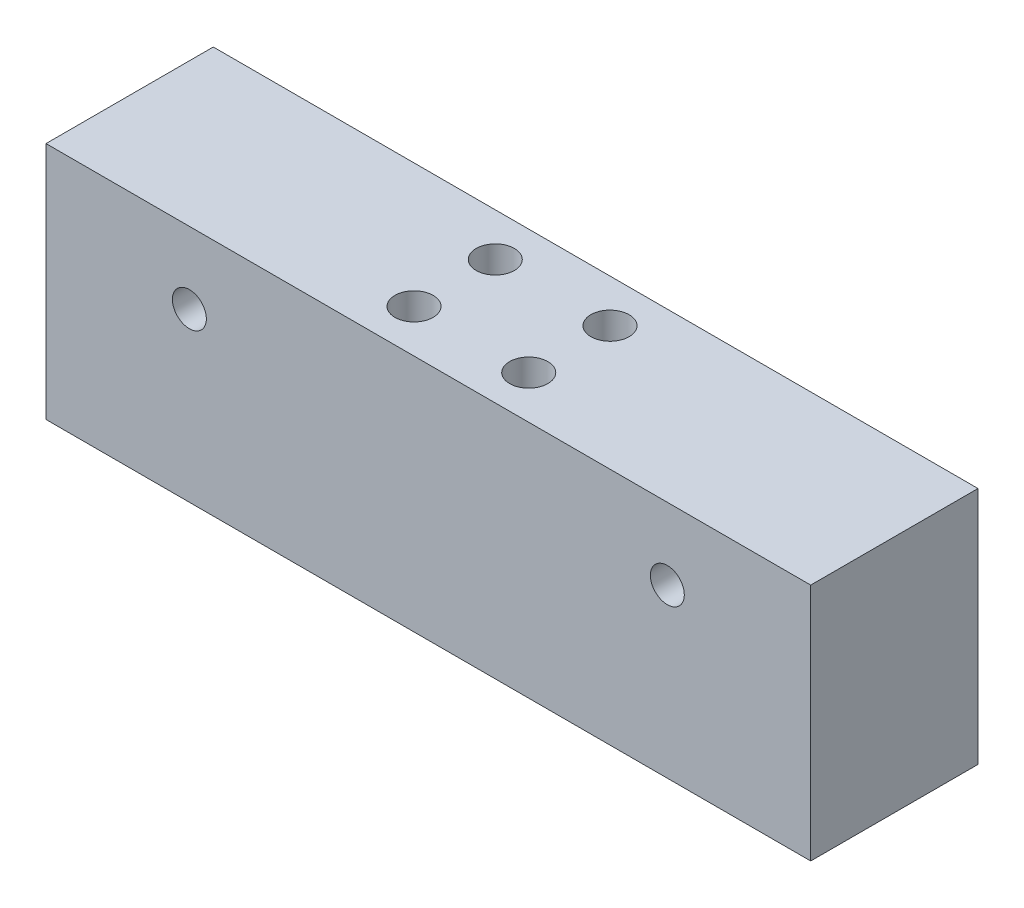
ISO-10303-21;
HEADER;
FILE_DESCRIPTION(('STEP AP214'),'2;1');
FILE_NAME('part.step','',(''),(''),'','','');
FILE_SCHEMA(('AUTOMOTIVE_DESIGN { 1 0 10303 214 1 1 1 1 }'));
ENDSEC;
DATA;
#1=APPLICATION_CONTEXT('core data for automotive mechanical design processes');
#2=APPLICATION_PROTOCOL_DEFINITION('international standard','automotive_design',2000,#1);
#3=PRODUCT_CONTEXT('',#1,'mechanical');
#4=PRODUCT('Part','Part','',(#3));
#5=PRODUCT_RELATED_PRODUCT_CATEGORY('part','',(#4));
#6=PRODUCT_DEFINITION_FORMATION('','',#4);
#7=PRODUCT_DEFINITION_CONTEXT('part definition',#1,'design');
#8=PRODUCT_DEFINITION('design','',#6,#7);
#9=PRODUCT_DEFINITION_SHAPE('','',#8);
#10=(LENGTH_UNIT() NAMED_UNIT(*) SI_UNIT(.MILLI.,.METRE.));
#11=(NAMED_UNIT(*) PLANE_ANGLE_UNIT() SI_UNIT($,.RADIAN.));
#12=(NAMED_UNIT(*) SI_UNIT($,.STERADIAN.) SOLID_ANGLE_UNIT());
#13=UNCERTAINTY_MEASURE_WITH_UNIT(LENGTH_MEASURE(1.E-05),#10,'distance_accuracy_value','');
#14=(GEOMETRIC_REPRESENTATION_CONTEXT(3) GLOBAL_UNCERTAINTY_ASSIGNED_CONTEXT((#13)) GLOBAL_UNIT_ASSIGNED_CONTEXT((#10,
#11,#12)) REPRESENTATION_CONTEXT('',''));
#15=CARTESIAN_POINT('',(0.,0.,0.));
#16=DIRECTION('',(0.,0.,1.));
#17=DIRECTION('',(1.,0.,0.));
#18=AXIS2_PLACEMENT_3D('',#15,#16,#17);
#19=CARTESIAN_POINT('',(1.48000000000004,64.235,9.));
#20=DIRECTION('',(0.,-1.,0.));
#21=DIRECTION('',(1.,0.,0.));
#22=AXIS2_PLACEMENT_3D('',#19,#20,#21);
#23=CYLINDRICAL_SURFACE('',#22,2.25);
#24=CARTESIAN_POINT('',(1.48000000000005,14.235,9.));
#25=DIRECTION('',(0.,-1.,0.));
#26=DIRECTION('',(1.,0.,0.));
#27=AXIS2_PLACEMENT_3D('',#24,#25,#26);
#28=CIRCLE('',#27,2.25);
#29=CARTESIAN_POINT('',(3.73000000000005,14.235,9.));
#30=VERTEX_POINT('',#29);
#31=EDGE_CURVE('E136',#30,#30,#28,.T.);
#32=CARTESIAN_POINT('',(1.48000000000004,54.235,9.));
#33=DIRECTION('',(0.,1.,0.));
#34=DIRECTION('',(0.,0.,1.));
#35=AXIS2_PLACEMENT_3D('',#32,#33,#34);
#36=CIRCLE('',#35,2.25);
#37=CARTESIAN_POINT('',(3.73000000000004,54.235,9.));
#38=VERTEX_POINT('',#37);
#39=EDGE_CURVE('E36',#38,#38,#36,.F.);
#40=CARTESIAN_POINT('',(3.73000000000005,14.235,9.));
#41=CARTESIAN_POINT('',(3.73000000000004,14.6516666666667,9.));
#42=CARTESIAN_POINT('',(3.73000000000004,15.0683333333333,9.));
#43=CARTESIAN_POINT('',(3.73000000000004,15.9016666666667,9.));
#44=CARTESIAN_POINT('',(3.73000000000004,16.3183333333333,9.));
#45=CARTESIAN_POINT('',(3.73000000000004,17.1516666666667,9.));
#46=CARTESIAN_POINT('',(3.73000000000004,17.5683333333333,9.));
#47=CARTESIAN_POINT('',(3.73000000000004,18.4016666666667,9.));
#48=CARTESIAN_POINT('',(3.73000000000004,18.8183333333333,9.));
#49=CARTESIAN_POINT('',(3.73000000000004,19.6516666666667,9.));
#50=CARTESIAN_POINT('',(3.73000000000004,20.0683333333333,9.));
#51=CARTESIAN_POINT('',(3.73000000000004,20.9016666666667,9.));
#52=CARTESIAN_POINT('',(3.73000000000004,21.3183333333333,9.));
#53=CARTESIAN_POINT('',(3.73000000000004,22.1516666666667,9.));
#54=CARTESIAN_POINT('',(3.73000000000004,22.5683333333333,9.));
#55=CARTESIAN_POINT('',(3.73000000000004,23.4016666666667,9.));
#56=CARTESIAN_POINT('',(3.73000000000004,23.8183333333333,9.));
#57=CARTESIAN_POINT('',(3.73000000000004,24.6516666666667,9.));
#58=CARTESIAN_POINT('',(3.73000000000004,25.0683333333333,9.));
#59=CARTESIAN_POINT('',(3.73000000000004,25.9016666666667,9.));
#60=CARTESIAN_POINT('',(3.73000000000004,26.3183333333333,9.));
#61=CARTESIAN_POINT('',(3.73000000000004,27.1516666666667,9.));
#62=CARTESIAN_POINT('',(3.73000000000004,27.5683333333333,9.));
#63=CARTESIAN_POINT('',(3.73000000000004,28.4016666666667,9.));
#64=CARTESIAN_POINT('',(3.73000000000004,28.8183333333333,9.));
#65=CARTESIAN_POINT('',(3.73000000000004,29.6516666666667,9.));
#66=CARTESIAN_POINT('',(3.73000000000004,30.0683333333333,9.));
#67=CARTESIAN_POINT('',(3.73000000000004,30.9016666666667,9.));
#68=CARTESIAN_POINT('',(3.73000000000004,31.3183333333333,9.));
#69=CARTESIAN_POINT('',(3.73000000000004,32.1516666666667,9.));
#70=CARTESIAN_POINT('',(3.73000000000004,32.5683333333333,9.));
#71=CARTESIAN_POINT('',(3.73000000000004,33.4016666666667,9.));
#72=CARTESIAN_POINT('',(3.73000000000004,33.8183333333333,9.));
#73=CARTESIAN_POINT('',(3.73000000000004,34.6516666666667,9.));
#74=CARTESIAN_POINT('',(3.73000000000004,35.0683333333333,9.));
#75=CARTESIAN_POINT('',(3.73000000000004,35.9016666666667,9.));
#76=CARTESIAN_POINT('',(3.73000000000004,36.3183333333333,9.));
#77=CARTESIAN_POINT('',(3.73000000000004,37.1516666666667,9.));
#78=CARTESIAN_POINT('',(3.73000000000004,37.5683333333333,9.));
#79=CARTESIAN_POINT('',(3.73000000000004,38.4016666666667,9.));
#80=CARTESIAN_POINT('',(3.73000000000004,38.8183333333333,9.));
#81=CARTESIAN_POINT('',(3.73000000000004,39.6516666666667,9.));
#82=CARTESIAN_POINT('',(3.73000000000004,40.0683333333333,9.));
#83=CARTESIAN_POINT('',(3.73000000000004,40.9016666666667,9.));
#84=CARTESIAN_POINT('',(3.73000000000004,41.3183333333333,9.));
#85=CARTESIAN_POINT('',(3.73000000000004,42.1516666666667,9.));
#86=CARTESIAN_POINT('',(3.73000000000004,42.5683333333333,9.));
#87=CARTESIAN_POINT('',(3.73000000000004,43.4016666666667,9.));
#88=CARTESIAN_POINT('',(3.73000000000004,43.8183333333333,9.));
#89=CARTESIAN_POINT('',(3.73000000000004,44.6516666666667,9.));
#90=CARTESIAN_POINT('',(3.73000000000004,45.0683333333333,9.));
#91=CARTESIAN_POINT('',(3.73000000000004,45.9016666666667,9.));
#92=CARTESIAN_POINT('',(3.73000000000004,46.3183333333333,9.));
#93=CARTESIAN_POINT('',(3.73000000000004,47.1516666666667,9.));
#94=CARTESIAN_POINT('',(3.73000000000004,47.5683333333333,9.));
#95=CARTESIAN_POINT('',(3.73000000000004,48.4016666666667,9.));
#96=CARTESIAN_POINT('',(3.73000000000004,48.8183333333333,9.));
#97=CARTESIAN_POINT('',(3.73000000000004,49.6516666666667,9.));
#98=CARTESIAN_POINT('',(3.73000000000004,50.0683333333333,9.));
#99=CARTESIAN_POINT('',(3.73000000000004,50.9016666666667,9.));
#100=CARTESIAN_POINT('',(3.73000000000004,51.3183333333333,9.));
#101=CARTESIAN_POINT('',(3.73000000000004,52.1516666666667,9.));
#102=CARTESIAN_POINT('',(3.73000000000004,52.5683333333333,9.));
#103=CARTESIAN_POINT('',(3.73000000000004,53.4016666666667,9.));
#104=CARTESIAN_POINT('',(3.73000000000004,53.8183333333333,9.));
#105=CARTESIAN_POINT('',(3.73000000000004,54.235,9.));
#106=B_SPLINE_CURVE_WITH_KNOTS('',3,(#40,#41,#42,#43,#44,#45,#46,#47,#48,#49,#50,#51,#52,#53,
#54,#55,#56,#57,#58,#59,#60,#61,#62,#63,#64,#65,#66,#67,#68,#69,#70,#71,#72,#73,#74,#75,#76,#77,
#78,#79,#80,#81,#82,#83,#84,#85,#86,#87,#88,#89,#90,#91,#92,#93,#94,#95,#96,#97,#98,#99,#100,
#101,#102,#103,#104,#105),.UNSPECIFIED.,.F.,.F.,(4,2,2,2,2,2,2,2,2,2,2,2,2,2,2,2,2,2,2,2,2,2,2,
2,2,2,2,2,2,2,2,2,4),(0.,1.25,2.5,3.75,5.,6.25,7.5,8.75,9.99999999999999,11.25,12.5,13.75,15.,
16.25,17.5,18.75,20.,21.25,22.5,23.75,25.,26.25,27.5,28.75,30.,31.25,32.5,33.75,35.,36.25,37.5,
38.75,40.),.UNSPECIFIED.);
#107=EDGE_CURVE('BSEAM32',#30,#38,#106,.T.);
#108=ORIENTED_EDGE('',*,*,#31,.T.);
#109=ORIENTED_EDGE('',*,*,#39,.F.);
#110=ORIENTED_EDGE('',*,*,#107,.T.);
#111=ORIENTED_EDGE('',*,*,#107,.F.);
#112=EDGE_LOOP('',(#108,#110,#109,#111));
#113=FACE_BOUND('',#112,.T.);
#114=ADVANCED_FACE('F32',(#113),#23,.F.);
#115=CARTESIAN_POINT('',(-22.52,64.235,26.));
#116=DIRECTION('',(0.,-1.,0.));
#117=DIRECTION('',(1.,0.,0.));
#118=AXIS2_PLACEMENT_3D('',#115,#116,#117);
#119=CYLINDRICAL_SURFACE('',#118,2.25);
#120=CARTESIAN_POINT('',(-22.52,14.235,26.));
#121=DIRECTION('',(0.,-1.,0.));
#122=DIRECTION('',(1.,0.,0.));
#123=AXIS2_PLACEMENT_3D('',#120,#121,#122);
#124=CIRCLE('',#123,2.25);
#125=CARTESIAN_POINT('',(-20.27,14.235,26.));
#126=VERTEX_POINT('',#125);
#127=EDGE_CURVE('E120',#126,#126,#124,.T.);
#128=CARTESIAN_POINT('',(-22.52,54.235,26.));
#129=DIRECTION('',(0.,1.,0.));
#130=DIRECTION('',(0.,0.,1.));
#131=AXIS2_PLACEMENT_3D('',#128,#129,#130);
#132=CIRCLE('',#131,2.25);
#133=CARTESIAN_POINT('',(-20.27,54.235,26.));
#134=VERTEX_POINT('',#133);
#135=EDGE_CURVE('E115',#134,#134,#132,.F.);
#136=CARTESIAN_POINT('',(-20.27,14.235,26.));
#137=CARTESIAN_POINT('',(-20.27,14.6516666666667,26.));
#138=CARTESIAN_POINT('',(-20.27,15.0683333333333,26.));
#139=CARTESIAN_POINT('',(-20.27,15.9016666666667,26.));
#140=CARTESIAN_POINT('',(-20.27,16.3183333333333,26.));
#141=CARTESIAN_POINT('',(-20.27,17.1516666666667,26.));
#142=CARTESIAN_POINT('',(-20.27,17.5683333333333,26.));
#143=CARTESIAN_POINT('',(-20.27,18.4016666666667,26.));
#144=CARTESIAN_POINT('',(-20.27,18.8183333333333,26.));
#145=CARTESIAN_POINT('',(-20.27,19.6516666666667,26.));
#146=CARTESIAN_POINT('',(-20.27,20.0683333333333,26.));
#147=CARTESIAN_POINT('',(-20.27,20.9016666666667,26.));
#148=CARTESIAN_POINT('',(-20.27,21.3183333333333,26.));
#149=CARTESIAN_POINT('',(-20.27,22.1516666666667,26.));
#150=CARTESIAN_POINT('',(-20.27,22.5683333333333,26.));
#151=CARTESIAN_POINT('',(-20.27,23.4016666666667,26.));
#152=CARTESIAN_POINT('',(-20.27,23.8183333333333,26.));
#153=CARTESIAN_POINT('',(-20.27,24.6516666666667,26.));
#154=CARTESIAN_POINT('',(-20.27,25.0683333333333,26.));
#155=CARTESIAN_POINT('',(-20.27,25.9016666666667,26.));
#156=CARTESIAN_POINT('',(-20.27,26.3183333333333,26.));
#157=CARTESIAN_POINT('',(-20.27,27.1516666666667,26.));
#158=CARTESIAN_POINT('',(-20.27,27.5683333333333,26.));
#159=CARTESIAN_POINT('',(-20.27,28.4016666666667,26.));
#160=CARTESIAN_POINT('',(-20.27,28.8183333333333,26.));
#161=CARTESIAN_POINT('',(-20.27,29.6516666666667,26.));
#162=CARTESIAN_POINT('',(-20.27,30.0683333333333,26.));
#163=CARTESIAN_POINT('',(-20.27,30.9016666666667,26.));
#164=CARTESIAN_POINT('',(-20.27,31.3183333333333,26.));
#165=CARTESIAN_POINT('',(-20.27,32.1516666666667,26.));
#166=CARTESIAN_POINT('',(-20.27,32.5683333333333,26.));
#167=CARTESIAN_POINT('',(-20.27,33.4016666666667,26.));
#168=CARTESIAN_POINT('',(-20.27,33.8183333333333,26.));
#169=CARTESIAN_POINT('',(-20.27,34.6516666666667,26.));
#170=CARTESIAN_POINT('',(-20.27,35.0683333333333,26.));
#171=CARTESIAN_POINT('',(-20.27,35.9016666666667,26.));
#172=CARTESIAN_POINT('',(-20.27,36.3183333333333,26.));
#173=CARTESIAN_POINT('',(-20.27,37.1516666666667,26.));
#174=CARTESIAN_POINT('',(-20.27,37.5683333333333,26.));
#175=CARTESIAN_POINT('',(-20.27,38.4016666666667,26.));
#176=CARTESIAN_POINT('',(-20.27,38.8183333333333,26.));
#177=CARTESIAN_POINT('',(-20.27,39.6516666666667,26.));
#178=CARTESIAN_POINT('',(-20.27,40.0683333333333,26.));
#179=CARTESIAN_POINT('',(-20.27,40.9016666666667,26.));
#180=CARTESIAN_POINT('',(-20.27,41.3183333333333,26.));
#181=CARTESIAN_POINT('',(-20.27,42.1516666666667,26.));
#182=CARTESIAN_POINT('',(-20.27,42.5683333333333,26.));
#183=CARTESIAN_POINT('',(-20.27,43.4016666666667,26.));
#184=CARTESIAN_POINT('',(-20.27,43.8183333333333,26.));
#185=CARTESIAN_POINT('',(-20.27,44.6516666666667,26.));
#186=CARTESIAN_POINT('',(-20.27,45.0683333333333,26.));
#187=CARTESIAN_POINT('',(-20.27,45.9016666666667,26.));
#188=CARTESIAN_POINT('',(-20.27,46.3183333333333,26.));
#189=CARTESIAN_POINT('',(-20.27,47.1516666666667,26.));
#190=CARTESIAN_POINT('',(-20.27,47.5683333333333,26.));
#191=CARTESIAN_POINT('',(-20.27,48.4016666666667,26.));
#192=CARTESIAN_POINT('',(-20.27,48.8183333333333,26.));
#193=CARTESIAN_POINT('',(-20.27,49.6516666666667,26.));
#194=CARTESIAN_POINT('',(-20.27,50.0683333333333,26.));
#195=CARTESIAN_POINT('',(-20.27,50.9016666666667,26.));
#196=CARTESIAN_POINT('',(-20.27,51.3183333333333,26.));
#197=CARTESIAN_POINT('',(-20.27,52.1516666666667,26.));
#198=CARTESIAN_POINT('',(-20.27,52.5683333333333,26.));
#199=CARTESIAN_POINT('',(-20.27,53.4016666666667,26.));
#200=CARTESIAN_POINT('',(-20.27,53.8183333333333,26.));
#201=CARTESIAN_POINT('',(-20.27,54.235,26.));
#202=B_SPLINE_CURVE_WITH_KNOTS('',3,(#136,#137,#138,#139,#140,#141,#142,#143,#144,#145,#146,
#147,#148,#149,#150,#151,#152,#153,#154,#155,#156,#157,#158,#159,#160,#161,#162,#163,#164,#165,
#166,#167,#168,#169,#170,#171,#172,#173,#174,#175,#176,#177,#178,#179,#180,#181,#182,#183,#184,
#185,#186,#187,#188,#189,#190,#191,#192,#193,#194,#195,#196,#197,#198,#199,#200,#201),
.UNSPECIFIED.,.F.,.F.,(4,2,2,2,2,2,2,2,2,2,2,2,2,2,2,2,2,2,2,2,2,2,2,2,2,2,2,2,2,2,2,2,4),(0.,
1.25,2.5,3.75,5.,6.25,7.5,8.75,9.99999999999999,11.25,12.5,13.75,15.,16.25,17.5,18.75,20.,21.25,
22.5,23.75,25.,26.25,27.5,28.75,30.,31.25,32.5,33.75,35.,36.25,37.5,38.75,40.),.UNSPECIFIED.);
#203=EDGE_CURVE('BSEAM171',#126,#134,#202,.T.);
#204=ORIENTED_EDGE('',*,*,#127,.T.);
#205=ORIENTED_EDGE('',*,*,#135,.F.);
#206=ORIENTED_EDGE('',*,*,#203,.T.);
#207=ORIENTED_EDGE('',*,*,#203,.F.);
#208=EDGE_LOOP('',(#204,#206,#205,#207));
#209=FACE_BOUND('',#208,.T.);
#210=ADVANCED_FACE('F171',(#209),#119,.F.);
#211=CARTESIAN_POINT('',(1.48000000000004,64.235,26.));
#212=DIRECTION('',(0.,-1.,0.));
#213=DIRECTION('',(1.,0.,0.));
#214=AXIS2_PLACEMENT_3D('',#211,#212,#213);
#215=CYLINDRICAL_SURFACE('',#214,2.25);
#216=CARTESIAN_POINT('',(1.48000000000004,14.235,26.));
#217=DIRECTION('',(0.,-1.,0.));
#218=DIRECTION('',(1.,0.,0.));
#219=AXIS2_PLACEMENT_3D('',#216,#217,#218);
#220=CIRCLE('',#219,2.25);
#221=CARTESIAN_POINT('',(3.73000000000004,14.235,26.));
#222=VERTEX_POINT('',#221);
#223=EDGE_CURVE('E124',#222,#222,#220,.T.);
#224=CARTESIAN_POINT('',(1.48000000000004,54.235,26.));
#225=DIRECTION('',(0.,1.,0.));
#226=DIRECTION('',(0.,0.,1.));
#227=AXIS2_PLACEMENT_3D('',#224,#225,#226);
#228=CIRCLE('',#227,2.25);
#229=CARTESIAN_POINT('',(3.73000000000004,54.235,26.));
#230=VERTEX_POINT('',#229);
#231=EDGE_CURVE('E112',#230,#230,#228,.F.);
#232=CARTESIAN_POINT('',(3.73000000000004,14.235,26.));
#233=CARTESIAN_POINT('',(3.73000000000004,14.6516666666667,26.));
#234=CARTESIAN_POINT('',(3.73000000000004,15.0683333333333,26.));
#235=CARTESIAN_POINT('',(3.73000000000004,15.9016666666667,26.));
#236=CARTESIAN_POINT('',(3.73000000000004,16.3183333333333,26.));
#237=CARTESIAN_POINT('',(3.73000000000004,17.1516666666667,26.));
#238=CARTESIAN_POINT('',(3.73000000000004,17.5683333333333,26.));
#239=CARTESIAN_POINT('',(3.73000000000004,18.4016666666667,26.));
#240=CARTESIAN_POINT('',(3.73000000000004,18.8183333333333,26.));
#241=CARTESIAN_POINT('',(3.73000000000004,19.6516666666667,26.));
#242=CARTESIAN_POINT('',(3.73000000000004,20.0683333333333,26.));
#243=CARTESIAN_POINT('',(3.73000000000004,20.9016666666667,26.));
#244=CARTESIAN_POINT('',(3.73000000000004,21.3183333333333,26.));
#245=CARTESIAN_POINT('',(3.73000000000004,22.1516666666667,26.));
#246=CARTESIAN_POINT('',(3.73000000000004,22.5683333333333,26.));
#247=CARTESIAN_POINT('',(3.73000000000004,23.4016666666667,26.));
#248=CARTESIAN_POINT('',(3.73000000000004,23.8183333333333,26.));
#249=CARTESIAN_POINT('',(3.73000000000004,24.6516666666667,26.));
#250=CARTESIAN_POINT('',(3.73000000000004,25.0683333333333,26.));
#251=CARTESIAN_POINT('',(3.73000000000004,25.9016666666667,26.));
#252=CARTESIAN_POINT('',(3.73000000000004,26.3183333333333,26.));
#253=CARTESIAN_POINT('',(3.73000000000004,27.1516666666667,26.));
#254=CARTESIAN_POINT('',(3.73000000000004,27.5683333333333,26.));
#255=CARTESIAN_POINT('',(3.73000000000004,28.4016666666667,26.));
#256=CARTESIAN_POINT('',(3.73000000000004,28.8183333333333,26.));
#257=CARTESIAN_POINT('',(3.73000000000004,29.6516666666667,26.));
#258=CARTESIAN_POINT('',(3.73000000000004,30.0683333333333,26.));
#259=CARTESIAN_POINT('',(3.73000000000004,30.9016666666667,26.));
#260=CARTESIAN_POINT('',(3.73000000000004,31.3183333333333,26.));
#261=CARTESIAN_POINT('',(3.73000000000004,32.1516666666667,26.));
#262=CARTESIAN_POINT('',(3.73000000000004,32.5683333333333,26.));
#263=CARTESIAN_POINT('',(3.73000000000004,33.4016666666667,26.));
#264=CARTESIAN_POINT('',(3.73000000000004,33.8183333333333,26.));
#265=CARTESIAN_POINT('',(3.73000000000004,34.6516666666667,26.));
#266=CARTESIAN_POINT('',(3.73000000000004,35.0683333333333,26.));
#267=CARTESIAN_POINT('',(3.73000000000004,35.9016666666667,26.));
#268=CARTESIAN_POINT('',(3.73000000000004,36.3183333333333,26.));
#269=CARTESIAN_POINT('',(3.73000000000004,37.1516666666667,26.));
#270=CARTESIAN_POINT('',(3.73000000000004,37.5683333333333,26.));
#271=CARTESIAN_POINT('',(3.73000000000004,38.4016666666667,26.));
#272=CARTESIAN_POINT('',(3.73000000000004,38.8183333333333,26.));
#273=CARTESIAN_POINT('',(3.73000000000004,39.6516666666667,26.));
#274=CARTESIAN_POINT('',(3.73000000000004,40.0683333333333,26.));
#275=CARTESIAN_POINT('',(3.73000000000004,40.9016666666667,26.));
#276=CARTESIAN_POINT('',(3.73000000000004,41.3183333333333,26.));
#277=CARTESIAN_POINT('',(3.73000000000004,42.1516666666667,26.));
#278=CARTESIAN_POINT('',(3.73000000000004,42.5683333333333,26.));
#279=CARTESIAN_POINT('',(3.73000000000004,43.4016666666667,26.));
#280=CARTESIAN_POINT('',(3.73000000000004,43.8183333333333,26.));
#281=CARTESIAN_POINT('',(3.73000000000004,44.6516666666667,26.));
#282=CARTESIAN_POINT('',(3.73000000000004,45.0683333333333,26.));
#283=CARTESIAN_POINT('',(3.73000000000004,45.9016666666667,26.));
#284=CARTESIAN_POINT('',(3.73000000000004,46.3183333333333,26.));
#285=CARTESIAN_POINT('',(3.73000000000004,47.1516666666667,26.));
#286=CARTESIAN_POINT('',(3.73000000000004,47.5683333333333,26.));
#287=CARTESIAN_POINT('',(3.73000000000004,48.4016666666667,26.));
#288=CARTESIAN_POINT('',(3.73000000000004,48.8183333333333,26.));
#289=CARTESIAN_POINT('',(3.73000000000004,49.6516666666667,26.));
#290=CARTESIAN_POINT('',(3.73000000000004,50.0683333333333,26.));
#291=CARTESIAN_POINT('',(3.73000000000004,50.9016666666667,26.));
#292=CARTESIAN_POINT('',(3.73000000000004,51.3183333333333,26.));
#293=CARTESIAN_POINT('',(3.73000000000004,52.1516666666667,26.));
#294=CARTESIAN_POINT('',(3.73000000000004,52.5683333333333,26.));
#295=CARTESIAN_POINT('',(3.73000000000004,53.4016666666667,26.));
#296=CARTESIAN_POINT('',(3.73000000000004,53.8183333333333,26.));
#297=CARTESIAN_POINT('',(3.73000000000004,54.235,26.));
#298=B_SPLINE_CURVE_WITH_KNOTS('',3,(#232,#233,#234,#235,#236,#237,#238,#239,#240,#241,#242,
#243,#244,#245,#246,#247,#248,#249,#250,#251,#252,#253,#254,#255,#256,#257,#258,#259,#260,#261,
#262,#263,#264,#265,#266,#267,#268,#269,#270,#271,#272,#273,#274,#275,#276,#277,#278,#279,#280,
#281,#282,#283,#284,#285,#286,#287,#288,#289,#290,#291,#292,#293,#294,#295,#296,#297),
.UNSPECIFIED.,.F.,.F.,(4,2,2,2,2,2,2,2,2,2,2,2,2,2,2,2,2,2,2,2,2,2,2,2,2,2,2,2,2,2,2,2,4),(0.,
1.25,2.5,3.75,5.,6.25,7.5,8.75,9.99999999999999,11.25,12.5,13.75,15.,16.25,17.5,18.75,20.,21.25,
22.5,23.75,25.,26.25,27.5,28.75,30.,31.25,32.5,33.75,35.,36.25,37.5,38.75,40.),.UNSPECIFIED.);
#299=EDGE_CURVE('BSEAM177',#222,#230,#298,.T.);
#300=ORIENTED_EDGE('',*,*,#223,.T.);
#301=ORIENTED_EDGE('',*,*,#231,.F.);
#302=ORIENTED_EDGE('',*,*,#299,.T.);
#303=ORIENTED_EDGE('',*,*,#299,.F.);
#304=EDGE_LOOP('',(#300,#302,#301,#303));
#305=FACE_BOUND('',#304,.T.);
#306=ADVANCED_FACE('F177',(#305),#215,.F.);
#307=CARTESIAN_POINT('',(-22.52,64.235,9.));
#308=DIRECTION('',(0.,-1.,0.));
#309=DIRECTION('',(1.,0.,0.));
#310=AXIS2_PLACEMENT_3D('',#307,#308,#309);
#311=CYLINDRICAL_SURFACE('',#310,2.25);
#312=CARTESIAN_POINT('',(-22.52,14.235,9.));
#313=DIRECTION('',(0.,-1.,0.));
#314=DIRECTION('',(1.,0.,0.));
#315=AXIS2_PLACEMENT_3D('',#312,#313,#314);
#316=CIRCLE('',#315,2.25);
#317=CARTESIAN_POINT('',(-20.27,14.235,9.));
#318=VERTEX_POINT('',#317);
#319=EDGE_CURVE('E129',#318,#318,#316,.T.);
#320=CARTESIAN_POINT('',(-22.52,54.235,9.));
#321=DIRECTION('',(0.,1.,0.));
#322=DIRECTION('',(0.,0.,1.));
#323=AXIS2_PLACEMENT_3D('',#320,#321,#322);
#324=CIRCLE('',#323,2.25);
#325=CARTESIAN_POINT('',(-20.27,54.235,9.));
#326=VERTEX_POINT('',#325);
#327=EDGE_CURVE('E109',#326,#326,#324,.F.);
#328=CARTESIAN_POINT('',(-20.27,14.235,9.));
#329=CARTESIAN_POINT('',(-20.27,14.6516666666667,9.));
#330=CARTESIAN_POINT('',(-20.27,15.0683333333333,9.));
#331=CARTESIAN_POINT('',(-20.27,15.9016666666667,9.));
#332=CARTESIAN_POINT('',(-20.27,16.3183333333333,9.));
#333=CARTESIAN_POINT('',(-20.27,17.1516666666667,9.));
#334=CARTESIAN_POINT('',(-20.27,17.5683333333333,9.));
#335=CARTESIAN_POINT('',(-20.27,18.4016666666667,9.));
#336=CARTESIAN_POINT('',(-20.27,18.8183333333333,9.));
#337=CARTESIAN_POINT('',(-20.27,19.6516666666667,9.));
#338=CARTESIAN_POINT('',(-20.27,20.0683333333333,9.));
#339=CARTESIAN_POINT('',(-20.27,20.9016666666667,9.));
#340=CARTESIAN_POINT('',(-20.27,21.3183333333333,9.));
#341=CARTESIAN_POINT('',(-20.27,22.1516666666667,9.));
#342=CARTESIAN_POINT('',(-20.27,22.5683333333333,9.));
#343=CARTESIAN_POINT('',(-20.27,23.4016666666667,9.));
#344=CARTESIAN_POINT('',(-20.27,23.8183333333333,9.));
#345=CARTESIAN_POINT('',(-20.27,24.6516666666667,9.));
#346=CARTESIAN_POINT('',(-20.27,25.0683333333333,9.));
#347=CARTESIAN_POINT('',(-20.27,25.9016666666667,9.));
#348=CARTESIAN_POINT('',(-20.27,26.3183333333333,9.));
#349=CARTESIAN_POINT('',(-20.27,27.1516666666667,9.));
#350=CARTESIAN_POINT('',(-20.27,27.5683333333333,9.));
#351=CARTESIAN_POINT('',(-20.27,28.4016666666667,9.));
#352=CARTESIAN_POINT('',(-20.27,28.8183333333333,9.));
#353=CARTESIAN_POINT('',(-20.27,29.6516666666667,9.));
#354=CARTESIAN_POINT('',(-20.27,30.0683333333333,9.));
#355=CARTESIAN_POINT('',(-20.27,30.9016666666667,9.));
#356=CARTESIAN_POINT('',(-20.27,31.3183333333333,9.));
#357=CARTESIAN_POINT('',(-20.27,32.1516666666667,9.));
#358=CARTESIAN_POINT('',(-20.27,32.5683333333333,9.));
#359=CARTESIAN_POINT('',(-20.27,33.4016666666667,9.));
#360=CARTESIAN_POINT('',(-20.27,33.8183333333333,9.));
#361=CARTESIAN_POINT('',(-20.27,34.6516666666667,9.));
#362=CARTESIAN_POINT('',(-20.27,35.0683333333333,9.));
#363=CARTESIAN_POINT('',(-20.27,35.9016666666667,9.));
#364=CARTESIAN_POINT('',(-20.27,36.3183333333333,9.));
#365=CARTESIAN_POINT('',(-20.27,37.1516666666667,9.));
#366=CARTESIAN_POINT('',(-20.27,37.5683333333333,9.));
#367=CARTESIAN_POINT('',(-20.27,38.4016666666667,9.));
#368=CARTESIAN_POINT('',(-20.27,38.8183333333333,9.));
#369=CARTESIAN_POINT('',(-20.27,39.6516666666667,9.));
#370=CARTESIAN_POINT('',(-20.27,40.0683333333333,9.));
#371=CARTESIAN_POINT('',(-20.27,40.9016666666667,9.));
#372=CARTESIAN_POINT('',(-20.27,41.3183333333333,9.));
#373=CARTESIAN_POINT('',(-20.27,42.1516666666667,9.));
#374=CARTESIAN_POINT('',(-20.27,42.5683333333333,9.));
#375=CARTESIAN_POINT('',(-20.27,43.4016666666667,9.));
#376=CARTESIAN_POINT('',(-20.27,43.8183333333333,9.));
#377=CARTESIAN_POINT('',(-20.27,44.6516666666667,9.));
#378=CARTESIAN_POINT('',(-20.27,45.0683333333333,9.));
#379=CARTESIAN_POINT('',(-20.27,45.9016666666667,9.));
#380=CARTESIAN_POINT('',(-20.27,46.3183333333333,9.));
#381=CARTESIAN_POINT('',(-20.27,47.1516666666667,9.));
#382=CARTESIAN_POINT('',(-20.27,47.5683333333333,9.));
#383=CARTESIAN_POINT('',(-20.27,48.4016666666667,9.));
#384=CARTESIAN_POINT('',(-20.27,48.8183333333333,9.));
#385=CARTESIAN_POINT('',(-20.27,49.6516666666667,9.));
#386=CARTESIAN_POINT('',(-20.27,50.0683333333333,9.));
#387=CARTESIAN_POINT('',(-20.27,50.9016666666667,9.));
#388=CARTESIAN_POINT('',(-20.27,51.3183333333333,9.));
#389=CARTESIAN_POINT('',(-20.27,52.1516666666667,9.));
#390=CARTESIAN_POINT('',(-20.27,52.5683333333333,9.));
#391=CARTESIAN_POINT('',(-20.27,53.4016666666667,9.));
#392=CARTESIAN_POINT('',(-20.27,53.8183333333333,9.));
#393=CARTESIAN_POINT('',(-20.27,54.235,9.));
#394=B_SPLINE_CURVE_WITH_KNOTS('',3,(#328,#329,#330,#331,#332,#333,#334,#335,#336,#337,#338,
#339,#340,#341,#342,#343,#344,#345,#346,#347,#348,#349,#350,#351,#352,#353,#354,#355,#356,#357,
#358,#359,#360,#361,#362,#363,#364,#365,#366,#367,#368,#369,#370,#371,#372,#373,#374,#375,#376,
#377,#378,#379,#380,#381,#382,#383,#384,#385,#386,#387,#388,#389,#390,#391,#392,#393),
.UNSPECIFIED.,.F.,.F.,(4,2,2,2,2,2,2,2,2,2,2,2,2,2,2,2,2,2,2,2,2,2,2,2,2,2,2,2,2,2,2,2,4),(0.,
1.25,2.5,3.75,5.,6.25,7.5,8.75,9.99999999999999,11.25,12.5,13.75,15.,16.25,17.5,18.75,20.,21.25,
22.5,23.75,25.,26.25,27.5,28.75,30.,31.25,32.5,33.75,35.,36.25,37.5,38.75,40.),.UNSPECIFIED.);
#395=EDGE_CURVE('BSEAM183',#318,#326,#394,.T.);
#396=ORIENTED_EDGE('',*,*,#319,.T.);
#397=ORIENTED_EDGE('',*,*,#327,.F.);
#398=ORIENTED_EDGE('',*,*,#395,.T.);
#399=ORIENTED_EDGE('',*,*,#395,.F.);
#400=EDGE_LOOP('',(#396,#398,#397,#399));
#401=FACE_BOUND('',#400,.T.);
#402=ADVANCED_FACE('F183',(#401),#311,.F.);
#403=CARTESIAN_POINT('',(0.,0.,35.));
#404=DIRECTION('',(0.,0.,-1.));
#405=DIRECTION('',(-1.,0.,0.));
#406=AXIS2_PLACEMENT_3D('',#403,#404,#405);
#407=PLANE('',#406);
#408=DIRECTION('',(1.,0.,0.));
#409=VECTOR('',#408,1.);
#410=CARTESIAN_POINT('',(-90.52,14.235,35.));
#411=LINE('',#410,#409);
#412=CARTESIAN_POINT('',(-90.52,14.235,35.));
#413=VERTEX_POINT('',#412);
#414=CARTESIAN_POINT('',(69.48,14.235,35.));
#415=VERTEX_POINT('',#414);
#416=EDGE_CURVE('E86',#413,#415,#411,.T.);
#417=ORIENTED_EDGE('',*,*,#416,.T.);
#418=DIRECTION('',(0.,1.,0.));
#419=VECTOR('',#418,1.);
#420=CARTESIAN_POINT('',(69.4800000000001,64.235,35.));
#421=LINE('',#420,#419);
#422=CARTESIAN_POINT('',(69.4800000000001,64.235,35.));
#423=VERTEX_POINT('',#422);
#424=EDGE_CURVE('E80',#415,#423,#421,.T.);
#425=ORIENTED_EDGE('',*,*,#424,.T.);
#426=DIRECTION('',(-1.,0.,0.));
#427=VECTOR('',#426,1.);
#428=CARTESIAN_POINT('',(4.48000000000004,64.235,35.));
#429=LINE('',#428,#427);
#430=CARTESIAN_POINT('',(-90.52,64.235,35.));
#431=VERTEX_POINT('',#430);
#432=EDGE_CURVE('E84',#423,#431,#429,.T.);
#433=ORIENTED_EDGE('',*,*,#432,.T.);
#434=DIRECTION('',(0.,-1.,0.));
#435=VECTOR('',#434,1.);
#436=CARTESIAN_POINT('',(-90.52,14.235,35.));
#437=LINE('',#436,#435);
#438=EDGE_CURVE('E51',#431,#413,#437,.T.);
#439=ORIENTED_EDGE('',*,*,#438,.T.);
#440=EDGE_LOOP('',(#417,#425,#433,#439));
#441=FACE_BOUND('',#440,.T.);
#442=CARTESIAN_POINT('',(-60.52,49.235,35.));
#443=DIRECTION('',(0.,0.,1.));
#444=DIRECTION('',(1.,0.,0.));
#445=AXIS2_PLACEMENT_3D('',#442,#443,#444);
#446=CIRCLE('',#445,3.55000000000001);
#447=CARTESIAN_POINT('',(-56.97,49.235,35.));
#448=VERTEX_POINT('',#447);
#449=EDGE_CURVE('E103',#448,#448,#446,.T.);
#450=ORIENTED_EDGE('',*,*,#449,.F.);
#451=EDGE_LOOP('',(#450));
#452=FACE_BOUND('',#451,.T.);
#453=CARTESIAN_POINT('',(39.48,49.235,35.));
#454=DIRECTION('',(0.,0.,1.));
#455=DIRECTION('',(1.,0.,0.));
#456=AXIS2_PLACEMENT_3D('',#453,#454,#455);
#457=CIRCLE('',#456,3.55);
#458=CARTESIAN_POINT('',(43.03,49.235,35.));
#459=VERTEX_POINT('',#458);
#460=EDGE_CURVE('E141',#459,#459,#457,.T.);
#461=ORIENTED_EDGE('',*,*,#460,.F.);
#462=EDGE_LOOP('',(#461));
#463=FACE_BOUND('',#462,.T.);
#464=ADVANCED_FACE('F81',(#441,#452,#463),#407,.F.);
#465=CARTESIAN_POINT('',(0.,0.,0.));
#466=DIRECTION('',(0.,0.,-1.));
#467=DIRECTION('',(-1.,0.,0.));
#468=AXIS2_PLACEMENT_3D('',#465,#466,#467);
#469=PLANE('',#468);
#470=CARTESIAN_POINT('',(-60.52,49.235,0.));
#471=DIRECTION('',(0.,0.,1.));
#472=DIRECTION('',(1.,0.,0.));
#473=AXIS2_PLACEMENT_3D('',#470,#471,#472);
#474=CIRCLE('',#473,3.55000000000001);
#475=CARTESIAN_POINT('',(-56.97,49.235,0.));
#476=VERTEX_POINT('',#475);
#477=EDGE_CURVE('E144',#476,#476,#474,.T.);
#478=ORIENTED_EDGE('',*,*,#477,.T.);
#479=EDGE_LOOP('',(#478));
#480=FACE_BOUND('',#479,.T.);
#481=DIRECTION('',(1.,0.,0.));
#482=VECTOR('',#481,1.);
#483=CARTESIAN_POINT('',(-90.52,14.235,0.));
#484=LINE('',#483,#482);
#485=CARTESIAN_POINT('',(-90.52,14.235,0.));
#486=VERTEX_POINT('',#485);
#487=CARTESIAN_POINT('',(69.48,14.235,0.));
#488=VERTEX_POINT('',#487);
#489=EDGE_CURVE('E100',#486,#488,#484,.T.);
#490=ORIENTED_EDGE('',*,*,#489,.F.);
#491=DIRECTION('',(0.,-1.,0.));
#492=VECTOR('',#491,1.);
#493=CARTESIAN_POINT('',(-90.52,14.235,0.));
#494=LINE('',#493,#492);
#495=CARTESIAN_POINT('',(-90.52,64.235,0.));
#496=VERTEX_POINT('',#495);
#497=EDGE_CURVE('E73',#496,#486,#494,.T.);
#498=ORIENTED_EDGE('',*,*,#497,.F.);
#499=DIRECTION('',(-1.,0.,0.));
#500=VECTOR('',#499,1.);
#501=CARTESIAN_POINT('',(-90.52,64.235,0.));
#502=LINE('',#501,#500);
#503=CARTESIAN_POINT('',(69.4800000000001,64.235,0.));
#504=VERTEX_POINT('',#503);
#505=EDGE_CURVE('E67',#504,#496,#502,.T.);
#506=ORIENTED_EDGE('',*,*,#505,.F.);
#507=DIRECTION('',(0.,1.,0.));
#508=VECTOR('',#507,1.);
#509=CARTESIAN_POINT('',(69.4800000000001,64.235,0.));
#510=LINE('',#509,#508);
#511=EDGE_CURVE('E91',#488,#504,#510,.T.);
#512=ORIENTED_EDGE('',*,*,#511,.F.);
#513=EDGE_LOOP('',(#490,#498,#506,#512));
#514=FACE_BOUND('',#513,.T.);
#515=CARTESIAN_POINT('',(39.48,49.235,0.));
#516=DIRECTION('',(0.,0.,1.));
#517=DIRECTION('',(1.,0.,0.));
#518=AXIS2_PLACEMENT_3D('',#515,#516,#517);
#519=CIRCLE('',#518,3.55);
#520=CARTESIAN_POINT('',(43.03,49.235,0.));
#521=VERTEX_POINT('',#520);
#522=EDGE_CURVE('E140',#521,#521,#519,.T.);
#523=ORIENTED_EDGE('',*,*,#522,.T.);
#524=EDGE_LOOP('',(#523));
#525=FACE_BOUND('',#524,.T.);
#526=ADVANCED_FACE('F152',(#480,#514,#525),#469,.T.);
#527=CARTESIAN_POINT('',(-90.52,14.235,35.));
#528=DIRECTION('',(0.,1.,0.));
#529=DIRECTION('',(-1.,0.,0.));
#530=AXIS2_PLACEMENT_3D('',#527,#528,#529);
#531=PLANE('',#530);
#532=ORIENTED_EDGE('',*,*,#319,.F.);
#533=EDGE_LOOP('',(#532));
#534=FACE_BOUND('',#533,.T.);
#535=ORIENTED_EDGE('',*,*,#223,.F.);
#536=EDGE_LOOP('',(#535));
#537=FACE_BOUND('',#536,.T.);
#538=ORIENTED_EDGE('',*,*,#127,.F.);
#539=EDGE_LOOP('',(#538));
#540=FACE_BOUND('',#539,.T.);
#541=ORIENTED_EDGE('',*,*,#31,.F.);
#542=EDGE_LOOP('',(#541));
#543=FACE_BOUND('',#542,.T.);
#544=ORIENTED_EDGE('',*,*,#489,.T.);
#545=DIRECTION('',(0.,0.,-1.));
#546=VECTOR('',#545,1.);
#547=CARTESIAN_POINT('',(69.48,14.235,35.));
#548=LINE('',#547,#546);
#549=EDGE_CURVE('E11',#415,#488,#548,.T.);
#550=ORIENTED_EDGE('',*,*,#549,.F.);
#551=ORIENTED_EDGE('',*,*,#416,.F.);
#552=DIRECTION('',(0.,0.,-1.));
#553=VECTOR('',#552,1.);
#554=CARTESIAN_POINT('',(-90.52,14.235,35.));
#555=LINE('',#554,#553);
#556=EDGE_CURVE('E96',#413,#486,#555,.T.);
#557=ORIENTED_EDGE('',*,*,#556,.T.);
#558=EDGE_LOOP('',(#544,#550,#551,#557));
#559=FACE_BOUND('',#558,.T.);
#560=ADVANCED_FACE('F34',(#534,#537,#540,#543,#559),#531,.F.);
#561=CARTESIAN_POINT('',(69.4800000000001,64.235,35.));
#562=DIRECTION('',(-1.,0.,0.));
#563=DIRECTION('',(0.,-1.,0.));
#564=AXIS2_PLACEMENT_3D('',#561,#562,#563);
#565=PLANE('',#564);
#566=ORIENTED_EDGE('',*,*,#511,.T.);
#567=DIRECTION('',(0.,0.,-1.));
#568=VECTOR('',#567,1.);
#569=CARTESIAN_POINT('',(69.4800000000001,64.235,35.));
#570=LINE('',#569,#568);
#571=EDGE_CURVE('E42',#423,#504,#570,.T.);
#572=ORIENTED_EDGE('',*,*,#571,.F.);
#573=ORIENTED_EDGE('',*,*,#424,.F.);
#574=ORIENTED_EDGE('',*,*,#549,.T.);
#575=EDGE_LOOP('',(#566,#572,#573,#574));
#576=FACE_BOUND('',#575,.T.);
#577=ADVANCED_FACE('F90',(#576),#565,.F.);
#578=CARTESIAN_POINT('',(-90.52,64.235,35.));
#579=DIRECTION('',(0.,-1.,0.));
#580=DIRECTION('',(0.,0.,-1.));
#581=AXIS2_PLACEMENT_3D('',#578,#579,#580);
#582=PLANE('',#581);
#583=CARTESIAN_POINT('',(1.48000000000004,64.235,9.));
#584=DIRECTION('',(0.,1.,0.));
#585=DIRECTION('',(0.,0.,1.));
#586=AXIS2_PLACEMENT_3D('',#583,#584,#585);
#587=CIRCLE('',#586,4.);
#588=CARTESIAN_POINT('',(1.48000000000004,64.235,13.));
#589=VERTEX_POINT('',#588);
#590=EDGE_CURVE('E238',#589,#589,#587,.T.);
#591=ORIENTED_EDGE('',*,*,#590,.F.);
#592=EDGE_LOOP('',(#591));
#593=FACE_BOUND('',#592,.T.);
#594=CARTESIAN_POINT('',(1.48000000000004,64.235,26.));
#595=DIRECTION('',(0.,1.,0.));
#596=DIRECTION('',(0.,0.,1.));
#597=AXIS2_PLACEMENT_3D('',#594,#595,#596);
#598=CIRCLE('',#597,4.);
#599=CARTESIAN_POINT('',(1.48000000000004,64.235,30.));
#600=VERTEX_POINT('',#599);
#601=EDGE_CURVE('E232',#600,#600,#598,.T.);
#602=ORIENTED_EDGE('',*,*,#601,.F.);
#603=EDGE_LOOP('',(#602));
#604=FACE_BOUND('',#603,.T.);
#605=CARTESIAN_POINT('',(-22.52,64.235,26.));
#606=DIRECTION('',(0.,1.,0.));
#607=DIRECTION('',(0.,0.,1.));
#608=AXIS2_PLACEMENT_3D('',#605,#606,#607);
#609=CIRCLE('',#608,4.);
#610=CARTESIAN_POINT('',(-22.52,64.235,30.));
#611=VERTEX_POINT('',#610);
#612=EDGE_CURVE('E223',#611,#611,#609,.T.);
#613=ORIENTED_EDGE('',*,*,#612,.F.);
#614=EDGE_LOOP('',(#613));
#615=FACE_BOUND('',#614,.T.);
#616=CARTESIAN_POINT('',(-22.52,64.235,9.));
#617=DIRECTION('',(0.,1.,0.));
#618=DIRECTION('',(0.,0.,1.));
#619=AXIS2_PLACEMENT_3D('',#616,#617,#618);
#620=CIRCLE('',#619,4.);
#621=CARTESIAN_POINT('',(-22.52,64.235,13.));
#622=VERTEX_POINT('',#621);
#623=EDGE_CURVE('E133',#622,#622,#620,.T.);
#624=ORIENTED_EDGE('',*,*,#623,.F.);
#625=EDGE_LOOP('',(#624));
#626=FACE_BOUND('',#625,.T.);
#627=ORIENTED_EDGE('',*,*,#505,.T.);
#628=DIRECTION('',(0.,0.,-1.));
#629=VECTOR('',#628,1.);
#630=CARTESIAN_POINT('',(-90.52,64.235,35.));
#631=LINE('',#630,#629);
#632=EDGE_CURVE('E92',#431,#496,#631,.T.);
#633=ORIENTED_EDGE('',*,*,#632,.F.);
#634=ORIENTED_EDGE('',*,*,#432,.F.);
#635=ORIENTED_EDGE('',*,*,#571,.T.);
#636=EDGE_LOOP('',(#627,#633,#634,#635));
#637=FACE_BOUND('',#636,.T.);
#638=ADVANCED_FACE('F94',(#593,#604,#615,#626,#637),#582,.F.);
#639=CARTESIAN_POINT('',(-90.52,14.235,35.));
#640=DIRECTION('',(1.,0.,0.));
#641=DIRECTION('',(0.,1.,0.));
#642=AXIS2_PLACEMENT_3D('',#639,#640,#641);
#643=PLANE('',#642);
#644=ORIENTED_EDGE('',*,*,#497,.T.);
#645=ORIENTED_EDGE('',*,*,#556,.F.);
#646=ORIENTED_EDGE('',*,*,#438,.F.);
#647=ORIENTED_EDGE('',*,*,#632,.T.);
#648=EDGE_LOOP('',(#644,#645,#646,#647));
#649=FACE_BOUND('',#648,.T.);
#650=ADVANCED_FACE('F158',(#649),#643,.F.);
#651=CARTESIAN_POINT('',(-60.52,49.235,35.));
#652=DIRECTION('',(0.,0.,-1.));
#653=DIRECTION('',(-1.,0.,0.));
#654=AXIS2_PLACEMENT_3D('',#651,#652,#653);
#655=CYLINDRICAL_SURFACE('',#654,3.55000000000001);
#656=ORIENTED_EDGE('',*,*,#449,.T.);
#657=EDGE_LOOP('',(#656));
#658=FACE_BOUND('',#657,.T.);
#659=ORIENTED_EDGE('',*,*,#477,.F.);
#660=EDGE_LOOP('',(#659));
#661=FACE_BOUND('',#660,.T.);
#662=ADVANCED_FACE('F155',(#658,#661),#655,.F.);
#663=CARTESIAN_POINT('',(39.48,49.235,35.));
#664=DIRECTION('',(0.,0.,-1.));
#665=DIRECTION('',(-1.,0.,0.));
#666=AXIS2_PLACEMENT_3D('',#663,#664,#665);
#667=CYLINDRICAL_SURFACE('',#666,3.55);
#668=ORIENTED_EDGE('',*,*,#460,.T.);
#669=EDGE_LOOP('',(#668));
#670=FACE_BOUND('',#669,.T.);
#671=ORIENTED_EDGE('',*,*,#522,.F.);
#672=EDGE_LOOP('',(#671));
#673=FACE_BOUND('',#672,.T.);
#674=ADVANCED_FACE('F157',(#670,#673),#667,.F.);
#675=CARTESIAN_POINT('',(-22.52,54.235,9.));
#676=DIRECTION('',(0.,1.,0.));
#677=DIRECTION('',(0.,0.,1.));
#678=AXIS2_PLACEMENT_3D('',#675,#676,#677);
#679=PLANE('',#678);
#680=CARTESIAN_POINT('',(-22.52,54.235,9.));
#681=DIRECTION('',(0.,1.,0.));
#682=DIRECTION('',(0.,0.,1.));
#683=AXIS2_PLACEMENT_3D('',#680,#681,#682);
#684=CIRCLE('',#683,4.);
#685=CARTESIAN_POINT('',(-22.52,54.235,13.));
#686=VERTEX_POINT('',#685);
#687=EDGE_CURVE('E113',#686,#686,#684,.T.);
#688=ORIENTED_EDGE('',*,*,#687,.T.);
#689=EDGE_LOOP('',(#688));
#690=FACE_BOUND('',#689,.T.);
#691=ORIENTED_EDGE('',*,*,#327,.T.);
#692=EDGE_LOOP('',(#691));
#693=FACE_BOUND('',#692,.T.);
#694=ADVANCED_FACE('F165',(#690,#693),#679,.T.);
#695=CARTESIAN_POINT('',(-22.52,54.235,9.));
#696=DIRECTION('',(0.,1.,0.));
#697=DIRECTION('',(0.,0.,1.));
#698=AXIS2_PLACEMENT_3D('',#695,#696,#697);
#699=CYLINDRICAL_SURFACE('',#698,4.);
#700=ORIENTED_EDGE('',*,*,#687,.F.);
#701=EDGE_LOOP('',(#700));
#702=FACE_BOUND('',#701,.T.);
#703=ORIENTED_EDGE('',*,*,#623,.T.);
#704=EDGE_LOOP('',(#703));
#705=FACE_BOUND('',#704,.T.);
#706=ADVANCED_FACE('F188',(#702,#705),#699,.F.);
#707=CARTESIAN_POINT('',(1.48000000000004,54.235,26.));
#708=DIRECTION('',(0.,1.,0.));
#709=DIRECTION('',(0.,0.,1.));
#710=AXIS2_PLACEMENT_3D('',#707,#708,#709);
#711=PLANE('',#710);
#712=CARTESIAN_POINT('',(1.48000000000004,54.235,26.));
#713=DIRECTION('',(0.,1.,0.));
#714=DIRECTION('',(0.,0.,1.));
#715=AXIS2_PLACEMENT_3D('',#712,#713,#714);
#716=CIRCLE('',#715,4.);
#717=CARTESIAN_POINT('',(1.48000000000004,54.235,30.));
#718=VERTEX_POINT('',#717);
#719=EDGE_CURVE('E227',#718,#718,#716,.T.);
#720=ORIENTED_EDGE('',*,*,#719,.T.);
#721=EDGE_LOOP('',(#720));
#722=FACE_BOUND('',#721,.T.);
#723=ORIENTED_EDGE('',*,*,#231,.T.);
#724=EDGE_LOOP('',(#723));
#725=FACE_BOUND('',#724,.T.);
#726=ADVANCED_FACE('F191',(#722,#725),#711,.T.);
#727=CARTESIAN_POINT('',(1.48000000000004,54.235,26.));
#728=DIRECTION('',(0.,1.,0.));
#729=DIRECTION('',(0.,0.,1.));
#730=AXIS2_PLACEMENT_3D('',#727,#728,#729);
#731=CYLINDRICAL_SURFACE('',#730,4.);
#732=ORIENTED_EDGE('',*,*,#719,.F.);
#733=EDGE_LOOP('',(#732));
#734=FACE_BOUND('',#733,.T.);
#735=ORIENTED_EDGE('',*,*,#601,.T.);
#736=EDGE_LOOP('',(#735));
#737=FACE_BOUND('',#736,.T.);
#738=ADVANCED_FACE('F205',(#734,#737),#731,.F.);
#739=CARTESIAN_POINT('',(-22.52,54.235,26.));
#740=DIRECTION('',(0.,1.,0.));
#741=DIRECTION('',(0.,0.,1.));
#742=AXIS2_PLACEMENT_3D('',#739,#740,#741);
#743=PLANE('',#742);
#744=CARTESIAN_POINT('',(-22.52,54.235,26.));
#745=DIRECTION('',(0.,1.,0.));
#746=DIRECTION('',(0.,0.,1.));
#747=AXIS2_PLACEMENT_3D('',#744,#745,#746);
#748=CIRCLE('',#747,4.);
#749=CARTESIAN_POINT('',(-22.52,54.235,30.));
#750=VERTEX_POINT('',#749);
#751=EDGE_CURVE('E222',#750,#750,#748,.T.);
#752=ORIENTED_EDGE('',*,*,#751,.T.);
#753=EDGE_LOOP('',(#752));
#754=FACE_BOUND('',#753,.T.);
#755=ORIENTED_EDGE('',*,*,#135,.T.);
#756=EDGE_LOOP('',(#755));
#757=FACE_BOUND('',#756,.T.);
#758=ADVANCED_FACE('F208',(#754,#757),#743,.T.);
#759=CARTESIAN_POINT('',(-22.52,54.235,26.));
#760=DIRECTION('',(0.,1.,0.));
#761=DIRECTION('',(0.,0.,1.));
#762=AXIS2_PLACEMENT_3D('',#759,#760,#761);
#763=CYLINDRICAL_SURFACE('',#762,4.);
#764=ORIENTED_EDGE('',*,*,#751,.F.);
#765=EDGE_LOOP('',(#764));
#766=FACE_BOUND('',#765,.T.);
#767=ORIENTED_EDGE('',*,*,#612,.T.);
#768=EDGE_LOOP('',(#767));
#769=FACE_BOUND('',#768,.T.);
#770=ADVANCED_FACE('F203',(#766,#769),#763,.F.);
#771=CARTESIAN_POINT('',(1.48000000000004,54.235,9.));
#772=DIRECTION('',(0.,1.,0.));
#773=DIRECTION('',(0.,0.,1.));
#774=AXIS2_PLACEMENT_3D('',#771,#772,#773);
#775=PLANE('',#774);
#776=CARTESIAN_POINT('',(1.48000000000004,54.235,9.));
#777=DIRECTION('',(0.,1.,0.));
#778=DIRECTION('',(0.,0.,1.));
#779=AXIS2_PLACEMENT_3D('',#776,#777,#778);
#780=CIRCLE('',#779,4.);
#781=CARTESIAN_POINT('',(1.48000000000004,54.235,13.));
#782=VERTEX_POINT('',#781);
#783=EDGE_CURVE('E235',#782,#782,#780,.T.);
#784=ORIENTED_EDGE('',*,*,#783,.T.);
#785=EDGE_LOOP('',(#784));
#786=FACE_BOUND('',#785,.T.);
#787=ORIENTED_EDGE('',*,*,#39,.T.);
#788=EDGE_LOOP('',(#787));
#789=FACE_BOUND('',#788,.T.);
#790=ADVANCED_FACE('F199',(#786,#789),#775,.T.);
#791=CARTESIAN_POINT('',(1.48000000000004,54.235,9.));
#792=DIRECTION('',(0.,1.,0.));
#793=DIRECTION('',(0.,0.,1.));
#794=AXIS2_PLACEMENT_3D('',#791,#792,#793);
#795=CYLINDRICAL_SURFACE('',#794,4.);
#796=ORIENTED_EDGE('',*,*,#783,.F.);
#797=EDGE_LOOP('',(#796));
#798=FACE_BOUND('',#797,.T.);
#799=ORIENTED_EDGE('',*,*,#590,.T.);
#800=EDGE_LOOP('',(#799));
#801=FACE_BOUND('',#800,.T.);
#802=ADVANCED_FACE('F196',(#798,#801),#795,.F.);
#803=CLOSED_SHELL('',(#114,#210,#306,#402,#464,#526,#560,#577,#638,#650,#662,#674,#694,#706,
#726,#738,#758,#770,#790,#802));
#804=MANIFOLD_SOLID_BREP('B2',#803);
#805=ADVANCED_BREP_SHAPE_REPRESENTATION('',(#18,#804),#14);
#806=SHAPE_DEFINITION_REPRESENTATION(#9,#805);
ENDSEC;
END-ISO-10303-21;
